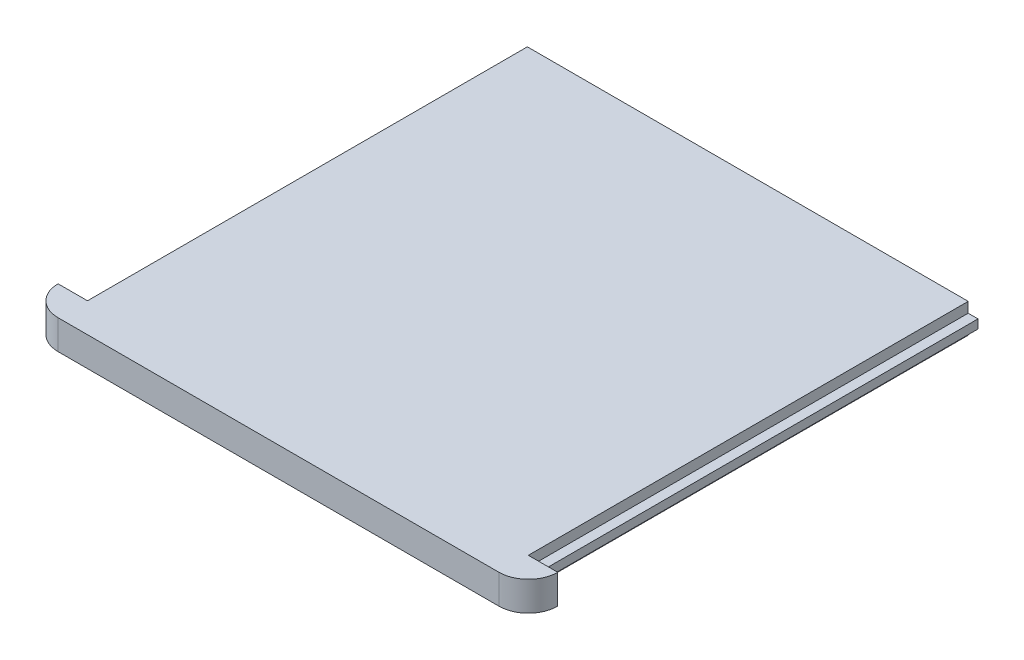
ISO-10303-21;
HEADER;
FILE_DESCRIPTION(('STEP AP214'),'2;1');
FILE_NAME('part.step','',(''),(''),'','','');
FILE_SCHEMA(('AUTOMOTIVE_DESIGN { 1 0 10303 214 1 1 1 1 }'));
ENDSEC;
DATA;
#1=APPLICATION_CONTEXT('core data for automotive mechanical design processes');
#2=APPLICATION_PROTOCOL_DEFINITION('international standard','automotive_design',2000,#1);
#3=PRODUCT_CONTEXT('',#1,'mechanical');
#4=PRODUCT('Part','Part','',(#3));
#5=PRODUCT_RELATED_PRODUCT_CATEGORY('part','',(#4));
#6=PRODUCT_DEFINITION_FORMATION('','',#4);
#7=PRODUCT_DEFINITION_CONTEXT('part definition',#1,'design');
#8=PRODUCT_DEFINITION('design','',#6,#7);
#9=PRODUCT_DEFINITION_SHAPE('','',#8);
#10=(LENGTH_UNIT() NAMED_UNIT(*) SI_UNIT(.MILLI.,.METRE.));
#11=(NAMED_UNIT(*) PLANE_ANGLE_UNIT() SI_UNIT($,.RADIAN.));
#12=(NAMED_UNIT(*) SI_UNIT($,.STERADIAN.) SOLID_ANGLE_UNIT());
#13=UNCERTAINTY_MEASURE_WITH_UNIT(LENGTH_MEASURE(1.E-05),#10,'distance_accuracy_value','');
#14=(GEOMETRIC_REPRESENTATION_CONTEXT(3) GLOBAL_UNCERTAINTY_ASSIGNED_CONTEXT((#13)) GLOBAL_UNIT_ASSIGNED_CONTEXT((#10,
#11,#12)) REPRESENTATION_CONTEXT('',''));
#15=CARTESIAN_POINT('',(0.,0.,0.));
#16=DIRECTION('',(0.,0.,1.));
#17=DIRECTION('',(1.,0.,0.));
#18=AXIS2_PLACEMENT_3D('',#15,#16,#17);
#19=CARTESIAN_POINT('',(-22.5,3.,-22.5));
#20=DIRECTION('',(1.,0.,0.));
#21=DIRECTION('',(0.,0.,-1.));
#22=AXIS2_PLACEMENT_3D('',#19,#20,#21);
#23=PLANE('',#22);
#24=DIRECTION('',(0.,-1.,0.));
#25=VECTOR('',#24,1.);
#26=CARTESIAN_POINT('',(-22.5,3.,22.4));
#27=LINE('',#26,#25);
#28=CARTESIAN_POINT('',(-22.5,3.,22.4));
#29=VERTEX_POINT('',#28);
#30=CARTESIAN_POINT('',(-22.5,1.95,22.4));
#31=VERTEX_POINT('',#30);
#32=EDGE_CURVE('E218',#29,#31,#27,.T.);
#33=ORIENTED_EDGE('',*,*,#32,.F.);
#34=DIRECTION('',(0.,0.,1.));
#35=VECTOR('',#34,1.);
#36=CARTESIAN_POINT('',(-22.5,3.,-22.5));
#37=LINE('',#36,#35);
#38=CARTESIAN_POINT('',(-22.5,3.,-22.5));
#39=VERTEX_POINT('',#38);
#40=EDGE_CURVE('E159',#39,#29,#37,.T.);
#41=ORIENTED_EDGE('',*,*,#40,.F.);
#42=DIRECTION('',(0.,-1.,0.));
#43=VECTOR('',#42,1.);
#44=CARTESIAN_POINT('',(-22.5,3.,-22.5));
#45=LINE('',#44,#43);
#46=CARTESIAN_POINT('',(-22.5,1.95,-22.5));
#47=VERTEX_POINT('',#46);
#48=EDGE_CURVE('E293',#39,#47,#45,.T.);
#49=ORIENTED_EDGE('',*,*,#48,.T.);
#50=DIRECTION('',(0.,0.,1.));
#51=VECTOR('',#50,1.);
#52=CARTESIAN_POINT('',(-22.5,1.95,-63.5));
#53=LINE('',#52,#51);
#54=EDGE_CURVE('E239',#47,#31,#53,.T.);
#55=ORIENTED_EDGE('',*,*,#54,.T.);
#56=EDGE_LOOP('',(#33,#41,#49,#55));
#57=FACE_BOUND('',#56,.T.);
#58=ADVANCED_FACE('F39',(#57),#23,.F.);
#59=DIRECTION('',(0.,-1.,0.));
#60=VECTOR('',#59,1.);
#61=CARTESIAN_POINT('',(-22.5,3.,22.4));
#62=LINE('',#61,#60);
#63=CARTESIAN_POINT('',(-22.5,1.05,22.4));
#64=VERTEX_POINT('',#63);
#65=CARTESIAN_POINT('',(-22.5,0.,22.4));
#66=VERTEX_POINT('',#65);
#67=EDGE_CURVE('E228',#64,#66,#62,.T.);
#68=ORIENTED_EDGE('',*,*,#67,.F.);
#69=DIRECTION('',(0.,0.,1.));
#70=VECTOR('',#69,1.);
#71=CARTESIAN_POINT('',(-22.5,1.05,-63.5));
#72=LINE('',#71,#70);
#73=CARTESIAN_POINT('',(-22.5,1.05,-22.5));
#74=VERTEX_POINT('',#73);
#75=EDGE_CURVE('E235',#74,#64,#72,.T.);
#76=ORIENTED_EDGE('',*,*,#75,.F.);
#77=CARTESIAN_POINT('',(-22.5,0.,-22.5));
#78=VERTEX_POINT('',#77);
#79=EDGE_CURVE('E284',#74,#78,#45,.T.);
#80=ORIENTED_EDGE('',*,*,#79,.T.);
#81=DIRECTION('',(0.,0.,1.));
#82=VECTOR('',#81,1.);
#83=CARTESIAN_POINT('',(-22.5,0.,-22.5));
#84=LINE('',#83,#82);
#85=EDGE_CURVE('E279',#78,#66,#84,.T.);
#86=ORIENTED_EDGE('',*,*,#85,.T.);
#87=EDGE_LOOP('',(#68,#76,#80,#86));
#88=FACE_BOUND('',#87,.T.);
#89=ADVANCED_FACE('F334',(#88),#23,.F.);
#90=CARTESIAN_POINT('',(22.5,3.,-22.5));
#91=DIRECTION('',(-1.,0.,0.));
#92=DIRECTION('',(0.,0.,1.));
#93=AXIS2_PLACEMENT_3D('',#90,#91,#92);
#94=PLANE('',#93);
#95=DIRECTION('',(0.,1.,0.));
#96=VECTOR('',#95,1.);
#97=CARTESIAN_POINT('',(22.5,3.,22.4));
#98=LINE('',#97,#96);
#99=CARTESIAN_POINT('',(22.5,1.95,22.4));
#100=VERTEX_POINT('',#99);
#101=CARTESIAN_POINT('',(22.5,3.,22.4));
#102=VERTEX_POINT('',#101);
#103=EDGE_CURVE('E199',#100,#102,#98,.T.);
#104=ORIENTED_EDGE('',*,*,#103,.F.);
#105=DIRECTION('',(0.,0.,1.));
#106=VECTOR('',#105,1.);
#107=CARTESIAN_POINT('',(22.5,1.95,-63.5));
#108=LINE('',#107,#106);
#109=CARTESIAN_POINT('',(22.5,1.95,-22.5));
#110=VERTEX_POINT('',#109);
#111=EDGE_CURVE('E234',#110,#100,#108,.T.);
#112=ORIENTED_EDGE('',*,*,#111,.F.);
#113=DIRECTION('',(0.,-1.,0.));
#114=VECTOR('',#113,1.);
#115=CARTESIAN_POINT('',(22.5,3.,-22.5));
#116=LINE('',#115,#114);
#117=CARTESIAN_POINT('',(22.5,3.,-22.5));
#118=VERTEX_POINT('',#117);
#119=EDGE_CURVE('E297',#118,#110,#116,.T.);
#120=ORIENTED_EDGE('',*,*,#119,.F.);
#121=DIRECTION('',(0.,0.,-1.));
#122=VECTOR('',#121,1.);
#123=CARTESIAN_POINT('',(22.5,3.,-22.5));
#124=LINE('',#123,#122);
#125=EDGE_CURVE('E275',#102,#118,#124,.T.);
#126=ORIENTED_EDGE('',*,*,#125,.F.);
#127=EDGE_LOOP('',(#104,#112,#120,#126));
#128=FACE_BOUND('',#127,.T.);
#129=ADVANCED_FACE('F340',(#128),#94,.F.);
#130=DIRECTION('',(0.,1.,0.));
#131=VECTOR('',#130,1.);
#132=CARTESIAN_POINT('',(22.5,3.,22.4));
#133=LINE('',#132,#131);
#134=CARTESIAN_POINT('',(22.5,0.,22.4));
#135=VERTEX_POINT('',#134);
#136=CARTESIAN_POINT('',(22.5,1.05,22.4));
#137=VERTEX_POINT('',#136);
#138=EDGE_CURVE('E215',#135,#137,#133,.T.);
#139=ORIENTED_EDGE('',*,*,#138,.F.);
#140=DIRECTION('',(0.,0.,-1.));
#141=VECTOR('',#140,1.);
#142=CARTESIAN_POINT('',(22.5,0.,-22.5));
#143=LINE('',#142,#141);
#144=CARTESIAN_POINT('',(22.5,0.,-22.5));
#145=VERTEX_POINT('',#144);
#146=EDGE_CURVE('E274',#135,#145,#143,.T.);
#147=ORIENTED_EDGE('',*,*,#146,.T.);
#148=CARTESIAN_POINT('',(22.5,1.05,-22.5));
#149=VERTEX_POINT('',#148);
#150=EDGE_CURVE('E296',#149,#145,#116,.T.);
#151=ORIENTED_EDGE('',*,*,#150,.F.);
#152=DIRECTION('',(0.,0.,1.));
#153=VECTOR('',#152,1.);
#154=CARTESIAN_POINT('',(22.5,1.05,-63.5));
#155=LINE('',#154,#153);
#156=EDGE_CURVE('E240',#149,#137,#155,.T.);
#157=ORIENTED_EDGE('',*,*,#156,.T.);
#158=EDGE_LOOP('',(#139,#147,#151,#157));
#159=FACE_BOUND('',#158,.T.);
#160=ADVANCED_FACE('F350',(#159),#94,.F.);
#161=CARTESIAN_POINT('',(0.,3.,0.));
#162=DIRECTION('',(0.,1.,0.));
#163=DIRECTION('',(0.,0.,1.));
#164=AXIS2_PLACEMENT_3D('',#161,#162,#163);
#165=PLANE('',#164);
#166=DIRECTION('',(-1.,0.,0.));
#167=VECTOR('',#166,1.);
#168=CARTESIAN_POINT('',(-25.5,3.,25.4));
#169=LINE('',#168,#167);
#170=CARTESIAN_POINT('',(22.5,3.,25.4));
#171=VERTEX_POINT('',#170);
#172=CARTESIAN_POINT('',(-22.5,3.,25.4));
#173=VERTEX_POINT('',#172);
#174=EDGE_CURVE('E194',#171,#173,#169,.T.);
#175=ORIENTED_EDGE('',*,*,#174,.F.);
#176=CARTESIAN_POINT('',(22.5,3.,22.4));
#177=DIRECTION('',(0.,1.,0.));
#178=DIRECTION('',(0.,0.,1.));
#179=AXIS2_PLACEMENT_3D('',#176,#177,#178);
#180=CIRCLE('',#179,3.);
#181=CARTESIAN_POINT('',(25.5,3.,22.4));
#182=VERTEX_POINT('',#181);
#183=EDGE_CURVE('E176',#171,#182,#180,.T.);
#184=ORIENTED_EDGE('',*,*,#183,.T.);
#185=DIRECTION('',(-1.,0.,0.));
#186=VECTOR('',#185,1.);
#187=CARTESIAN_POINT('',(-22.5,3.,22.4));
#188=LINE('',#187,#186);
#189=EDGE_CURVE('E163',#182,#102,#188,.T.);
#190=ORIENTED_EDGE('',*,*,#189,.T.);
#191=ORIENTED_EDGE('',*,*,#125,.T.);
#192=DIRECTION('',(-1.,0.,0.));
#193=VECTOR('',#192,1.);
#194=CARTESIAN_POINT('',(-22.5,3.,-22.5));
#195=LINE('',#194,#193);
#196=EDGE_CURVE('E278',#118,#39,#195,.T.);
#197=ORIENTED_EDGE('',*,*,#196,.T.);
#198=ORIENTED_EDGE('',*,*,#40,.T.);
#199=CARTESIAN_POINT('',(-25.5,3.,22.4));
#200=VERTEX_POINT('',#199);
#201=EDGE_CURVE('E151',#29,#200,#188,.T.);
#202=ORIENTED_EDGE('',*,*,#201,.T.);
#203=CARTESIAN_POINT('',(-22.5,3.,22.4));
#204=DIRECTION('',(0.,1.,0.));
#205=DIRECTION('',(0.,0.,1.));
#206=AXIS2_PLACEMENT_3D('',#203,#204,#205);
#207=CIRCLE('',#206,3.);
#208=EDGE_CURVE('E156',#200,#173,#207,.T.);
#209=ORIENTED_EDGE('',*,*,#208,.T.);
#210=EDGE_LOOP('',(#175,#184,#190,#191,#197,#198,#202,#209));
#211=FACE_BOUND('',#210,.T.);
#212=ADVANCED_FACE('F154',(#211),#165,.T.);
#213=CARTESIAN_POINT('',(0.,0.,0.));
#214=DIRECTION('',(0.,1.,0.));
#215=DIRECTION('',(0.,0.,1.));
#216=AXIS2_PLACEMENT_3D('',#213,#214,#215);
#217=PLANE('',#216);
#218=DIRECTION('',(1.,0.,0.));
#219=VECTOR('',#218,1.);
#220=CARTESIAN_POINT('',(25.5,0.,22.4));
#221=LINE('',#220,#219);
#222=CARTESIAN_POINT('',(25.5,0.,22.4));
#223=VERTEX_POINT('',#222);
#224=EDGE_CURVE('E172',#135,#223,#221,.T.);
#225=ORIENTED_EDGE('',*,*,#224,.T.);
#226=CARTESIAN_POINT('',(22.5,0.,22.4));
#227=DIRECTION('',(0.,1.,0.));
#228=DIRECTION('',(0.,0.,1.));
#229=AXIS2_PLACEMENT_3D('',#226,#227,#228);
#230=CIRCLE('',#229,3.);
#231=CARTESIAN_POINT('',(22.5,0.,25.4));
#232=VERTEX_POINT('',#231);
#233=EDGE_CURVE('E11',#223,#232,#230,.F.);
#234=ORIENTED_EDGE('',*,*,#233,.T.);
#235=DIRECTION('',(1.,0.,0.));
#236=VECTOR('',#235,1.);
#237=CARTESIAN_POINT('',(25.5,0.,25.4));
#238=LINE('',#237,#236);
#239=CARTESIAN_POINT('',(-22.5,0.,25.4));
#240=VERTEX_POINT('',#239);
#241=EDGE_CURVE('E189',#240,#232,#238,.T.);
#242=ORIENTED_EDGE('',*,*,#241,.F.);
#243=CARTESIAN_POINT('',(-22.5,0.,22.4));
#244=DIRECTION('',(0.,1.,0.));
#245=DIRECTION('',(0.,0.,1.));
#246=AXIS2_PLACEMENT_3D('',#243,#244,#245);
#247=CIRCLE('',#246,3.);
#248=CARTESIAN_POINT('',(-25.5,0.,22.4));
#249=VERTEX_POINT('',#248);
#250=EDGE_CURVE('E48',#240,#249,#247,.F.);
#251=ORIENTED_EDGE('',*,*,#250,.T.);
#252=EDGE_CURVE('E170',#249,#66,#221,.T.);
#253=ORIENTED_EDGE('',*,*,#252,.T.);
#254=ORIENTED_EDGE('',*,*,#85,.F.);
#255=DIRECTION('',(-1.,0.,0.));
#256=VECTOR('',#255,1.);
#257=CARTESIAN_POINT('',(-22.5,0.,-22.5));
#258=LINE('',#257,#256);
#259=EDGE_CURVE('E287',#145,#78,#258,.T.);
#260=ORIENTED_EDGE('',*,*,#259,.F.);
#261=ORIENTED_EDGE('',*,*,#146,.F.);
#262=EDGE_LOOP('',(#225,#234,#242,#251,#253,#254,#260,#261));
#263=FACE_BOUND('',#262,.T.);
#264=ADVANCED_FACE('F186',(#263),#217,.F.);
#265=CARTESIAN_POINT('',(23.5,0.,0.));
#266=DIRECTION('',(1.,0.,0.));
#267=DIRECTION('',(0.,0.,-1.));
#268=AXIS2_PLACEMENT_3D('',#265,#266,#267);
#269=PLANE('',#268);
#270=DIRECTION('',(0.,0.,-1.));
#271=VECTOR('',#270,1.);
#272=CARTESIAN_POINT('',(23.5,1.95,0.));
#273=LINE('',#272,#271);
#274=CARTESIAN_POINT('',(23.5,1.95,22.4));
#275=VERTEX_POINT('',#274);
#276=CARTESIAN_POINT('',(23.5,1.95,-22.5));
#277=VERTEX_POINT('',#276);
#278=EDGE_CURVE('E311',#275,#277,#273,.T.);
#279=ORIENTED_EDGE('',*,*,#278,.F.);
#280=DIRECTION('',(0.,-1.,0.));
#281=VECTOR('',#280,1.);
#282=CARTESIAN_POINT('',(23.5,0.,22.4));
#283=LINE('',#282,#281);
#284=CARTESIAN_POINT('',(23.5,1.05,22.4));
#285=VERTEX_POINT('',#284);
#286=EDGE_CURVE('E193',#275,#285,#283,.T.);
#287=ORIENTED_EDGE('',*,*,#286,.T.);
#288=DIRECTION('',(0.,0.,1.));
#289=VECTOR('',#288,1.);
#290=CARTESIAN_POINT('',(23.5,1.05,0.));
#291=LINE('',#290,#289);
#292=CARTESIAN_POINT('',(23.5,1.05,-22.5));
#293=VERTEX_POINT('',#292);
#294=EDGE_CURVE('E307',#293,#285,#291,.T.);
#295=ORIENTED_EDGE('',*,*,#294,.F.);
#296=DIRECTION('',(0.,1.,0.));
#297=VECTOR('',#296,1.);
#298=CARTESIAN_POINT('',(23.5,1.,-22.5));
#299=LINE('',#298,#297);
#300=EDGE_CURVE('E270',#293,#277,#299,.T.);
#301=ORIENTED_EDGE('',*,*,#300,.T.);
#302=EDGE_LOOP('',(#279,#287,#295,#301));
#303=FACE_BOUND('',#302,.T.);
#304=ADVANCED_FACE('F366',(#303),#269,.T.);
#305=CARTESIAN_POINT('',(-23.5,0.,0.));
#306=DIRECTION('',(-1.,0.,0.));
#307=DIRECTION('',(0.,-1.,0.));
#308=AXIS2_PLACEMENT_3D('',#305,#306,#307);
#309=PLANE('',#308);
#310=DIRECTION('',(0.,0.,-1.));
#311=VECTOR('',#310,1.);
#312=CARTESIAN_POINT('',(-23.5,1.05,0.));
#313=LINE('',#312,#311);
#314=CARTESIAN_POINT('',(-23.5,1.05,22.4));
#315=VERTEX_POINT('',#314);
#316=CARTESIAN_POINT('',(-23.5,1.05,-22.5));
#317=VERTEX_POINT('',#316);
#318=EDGE_CURVE('E304',#315,#317,#313,.T.);
#319=ORIENTED_EDGE('',*,*,#318,.F.);
#320=DIRECTION('',(0.,1.,0.));
#321=VECTOR('',#320,1.);
#322=CARTESIAN_POINT('',(-23.5,0.,22.4));
#323=LINE('',#322,#321);
#324=CARTESIAN_POINT('',(-23.5,1.95,22.4));
#325=VERTEX_POINT('',#324);
#326=EDGE_CURVE('E224',#315,#325,#323,.T.);
#327=ORIENTED_EDGE('',*,*,#326,.T.);
#328=DIRECTION('',(0.,0.,1.));
#329=VECTOR('',#328,1.);
#330=CARTESIAN_POINT('',(-23.5,1.95,0.));
#331=LINE('',#330,#329);
#332=CARTESIAN_POINT('',(-23.5,1.95,-22.5));
#333=VERTEX_POINT('',#332);
#334=EDGE_CURVE('E300',#333,#325,#331,.T.);
#335=ORIENTED_EDGE('',*,*,#334,.F.);
#336=DIRECTION('',(0.,-1.,0.));
#337=VECTOR('',#336,1.);
#338=CARTESIAN_POINT('',(-23.5,2.,-22.5));
#339=LINE('',#338,#337);
#340=EDGE_CURVE('E266',#333,#317,#339,.T.);
#341=ORIENTED_EDGE('',*,*,#340,.T.);
#342=EDGE_LOOP('',(#319,#327,#335,#341));
#343=FACE_BOUND('',#342,.T.);
#344=ADVANCED_FACE('F385',(#343),#309,.T.);
#345=CARTESIAN_POINT('',(-23.5,1.95,-63.5));
#346=DIRECTION('',(0.,-1.,0.));
#347=DIRECTION('',(0.,0.,-1.));
#348=AXIS2_PLACEMENT_3D('',#345,#346,#347);
#349=PLANE('',#348);
#350=DIRECTION('',(-1.,0.,0.));
#351=VECTOR('',#350,1.);
#352=CARTESIAN_POINT('',(-23.5,1.95,22.4));
#353=LINE('',#352,#351);
#354=EDGE_CURVE('E221',#31,#325,#353,.T.);
#355=ORIENTED_EDGE('',*,*,#354,.F.);
#356=ORIENTED_EDGE('',*,*,#54,.F.);
#357=DIRECTION('',(1.,0.,0.));
#358=VECTOR('',#357,1.);
#359=CARTESIAN_POINT('',(-22.5,1.95,-22.5));
#360=LINE('',#359,#358);
#361=EDGE_CURVE('E250',#333,#47,#360,.T.);
#362=ORIENTED_EDGE('',*,*,#361,.F.);
#363=ORIENTED_EDGE('',*,*,#334,.T.);
#364=EDGE_LOOP('',(#355,#356,#362,#363));
#365=FACE_BOUND('',#364,.T.);
#366=ADVANCED_FACE('F391',(#365),#349,.F.);
#367=CARTESIAN_POINT('',(-23.5,1.05,-63.5));
#368=DIRECTION('',(0.,1.,0.));
#369=DIRECTION('',(0.,0.,1.));
#370=AXIS2_PLACEMENT_3D('',#367,#368,#369);
#371=PLANE('',#370);
#372=DIRECTION('',(1.,0.,0.));
#373=VECTOR('',#372,1.);
#374=CARTESIAN_POINT('',(-23.5,1.05,22.4));
#375=LINE('',#374,#373);
#376=EDGE_CURVE('E231',#315,#64,#375,.T.);
#377=ORIENTED_EDGE('',*,*,#376,.F.);
#378=ORIENTED_EDGE('',*,*,#318,.T.);
#379=DIRECTION('',(-1.,0.,0.));
#380=VECTOR('',#379,1.);
#381=CARTESIAN_POINT('',(-22.5,1.05,-22.5));
#382=LINE('',#381,#380);
#383=EDGE_CURVE('E254',#74,#317,#382,.T.);
#384=ORIENTED_EDGE('',*,*,#383,.F.);
#385=ORIENTED_EDGE('',*,*,#75,.T.);
#386=EDGE_LOOP('',(#377,#378,#384,#385));
#387=FACE_BOUND('',#386,.T.);
#388=ADVANCED_FACE('F382',(#387),#371,.F.);
#389=CARTESIAN_POINT('',(23.5,1.05,-63.5));
#390=DIRECTION('',(0.,1.,0.));
#391=DIRECTION('',(0.,0.,1.));
#392=AXIS2_PLACEMENT_3D('',#389,#390,#391);
#393=PLANE('',#392);
#394=DIRECTION('',(1.,0.,0.));
#395=VECTOR('',#394,1.);
#396=CARTESIAN_POINT('',(23.5,1.05,22.4));
#397=LINE('',#396,#395);
#398=EDGE_CURVE('E212',#137,#285,#397,.T.);
#399=ORIENTED_EDGE('',*,*,#398,.F.);
#400=ORIENTED_EDGE('',*,*,#156,.F.);
#401=DIRECTION('',(-1.,0.,0.));
#402=VECTOR('',#401,1.);
#403=CARTESIAN_POINT('',(-22.5,1.05,-22.5));
#404=LINE('',#403,#402);
#405=EDGE_CURVE('E258',#293,#149,#404,.T.);
#406=ORIENTED_EDGE('',*,*,#405,.F.);
#407=ORIENTED_EDGE('',*,*,#294,.T.);
#408=EDGE_LOOP('',(#399,#400,#406,#407));
#409=FACE_BOUND('',#408,.T.);
#410=ADVANCED_FACE('F369',(#409),#393,.F.);
#411=CARTESIAN_POINT('',(23.5,1.95,-63.5));
#412=DIRECTION('',(0.,-1.,0.));
#413=DIRECTION('',(0.,0.,-1.));
#414=AXIS2_PLACEMENT_3D('',#411,#412,#413);
#415=PLANE('',#414);
#416=DIRECTION('',(-1.,0.,0.));
#417=VECTOR('',#416,1.);
#418=CARTESIAN_POINT('',(23.5,1.95,22.4));
#419=LINE('',#418,#417);
#420=EDGE_CURVE('E314',#275,#100,#419,.T.);
#421=ORIENTED_EDGE('',*,*,#420,.F.);
#422=ORIENTED_EDGE('',*,*,#278,.T.);
#423=DIRECTION('',(1.,0.,0.));
#424=VECTOR('',#423,1.);
#425=CARTESIAN_POINT('',(-22.5,1.95,-22.5));
#426=LINE('',#425,#424);
#427=EDGE_CURVE('E262',#110,#277,#426,.T.);
#428=ORIENTED_EDGE('',*,*,#427,.F.);
#429=ORIENTED_EDGE('',*,*,#111,.T.);
#430=EDGE_LOOP('',(#421,#422,#428,#429));
#431=FACE_BOUND('',#430,.T.);
#432=ADVANCED_FACE('F347',(#431),#415,.F.);
#433=CARTESIAN_POINT('',(-22.5,3.,-22.5));
#434=DIRECTION('',(0.,0.,1.));
#435=DIRECTION('',(1.,0.,0.));
#436=AXIS2_PLACEMENT_3D('',#433,#434,#435);
#437=PLANE('',#436);
#438=ORIENTED_EDGE('',*,*,#119,.T.);
#439=ORIENTED_EDGE('',*,*,#427,.T.);
#440=ORIENTED_EDGE('',*,*,#300,.F.);
#441=ORIENTED_EDGE('',*,*,#405,.T.);
#442=ORIENTED_EDGE('',*,*,#150,.T.);
#443=ORIENTED_EDGE('',*,*,#259,.T.);
#444=ORIENTED_EDGE('',*,*,#79,.F.);
#445=ORIENTED_EDGE('',*,*,#383,.T.);
#446=ORIENTED_EDGE('',*,*,#340,.F.);
#447=ORIENTED_EDGE('',*,*,#361,.T.);
#448=ORIENTED_EDGE('',*,*,#48,.F.);
#449=ORIENTED_EDGE('',*,*,#196,.F.);
#450=EDGE_LOOP('',(#438,#439,#440,#441,#442,#443,#444,#445,#446,#447,#448,#449));
#451=FACE_BOUND('',#450,.T.);
#452=ADVANCED_FACE('F345',(#451),#437,.F.);
#453=CARTESIAN_POINT('',(0.,0.,22.4));
#454=DIRECTION('',(0.,0.,-1.));
#455=DIRECTION('',(-1.,0.,0.));
#456=AXIS2_PLACEMENT_3D('',#453,#454,#455);
#457=PLANE('',#456);
#458=ORIENTED_EDGE('',*,*,#224,.F.);
#459=ORIENTED_EDGE('',*,*,#138,.T.);
#460=ORIENTED_EDGE('',*,*,#398,.T.);
#461=ORIENTED_EDGE('',*,*,#286,.F.);
#462=ORIENTED_EDGE('',*,*,#420,.T.);
#463=ORIENTED_EDGE('',*,*,#103,.T.);
#464=ORIENTED_EDGE('',*,*,#189,.F.);
#465=DIRECTION('',(0.,1.,0.));
#466=VECTOR('',#465,1.);
#467=CARTESIAN_POINT('',(25.5,3.,22.4));
#468=LINE('',#467,#466);
#469=EDGE_CURVE('E164',#223,#182,#468,.T.);
#470=ORIENTED_EDGE('',*,*,#469,.F.);
#471=EDGE_LOOP('',(#458,#459,#460,#461,#462,#463,#464,#470));
#472=FACE_BOUND('',#471,.T.);
#473=ADVANCED_FACE('F323',(#472),#457,.T.);
#474=CARTESIAN_POINT('',(0.,0.,25.4));
#475=DIRECTION('',(0.,0.,-1.));
#476=DIRECTION('',(-1.,0.,0.));
#477=AXIS2_PLACEMENT_3D('',#474,#475,#476);
#478=PLANE('',#477);
#479=ORIENTED_EDGE('',*,*,#241,.T.);
#480=DIRECTION('',(0.,1.,0.));
#481=VECTOR('',#480,1.);
#482=CARTESIAN_POINT('',(22.5,0.,25.4));
#483=LINE('',#482,#481);
#484=EDGE_CURVE('E177',#232,#171,#483,.T.);
#485=ORIENTED_EDGE('',*,*,#484,.T.);
#486=ORIENTED_EDGE('',*,*,#174,.T.);
#487=DIRECTION('',(0.,-1.,0.));
#488=VECTOR('',#487,1.);
#489=CARTESIAN_POINT('',(-22.5,0.,25.4));
#490=LINE('',#489,#488);
#491=EDGE_CURVE('E174',#173,#240,#490,.T.);
#492=ORIENTED_EDGE('',*,*,#491,.T.);
#493=EDGE_LOOP('',(#479,#485,#486,#492));
#494=FACE_BOUND('',#493,.T.);
#495=ADVANCED_FACE('F317',(#494),#478,.F.);
#496=ORIENTED_EDGE('',*,*,#376,.T.);
#497=ORIENTED_EDGE('',*,*,#67,.T.);
#498=ORIENTED_EDGE('',*,*,#252,.F.);
#499=DIRECTION('',(0.,-1.,0.));
#500=VECTOR('',#499,1.);
#501=CARTESIAN_POINT('',(-25.5,0.,22.4));
#502=LINE('',#501,#500);
#503=EDGE_CURVE('E167',#200,#249,#502,.T.);
#504=ORIENTED_EDGE('',*,*,#503,.F.);
#505=ORIENTED_EDGE('',*,*,#201,.F.);
#506=ORIENTED_EDGE('',*,*,#32,.T.);
#507=ORIENTED_EDGE('',*,*,#354,.T.);
#508=ORIENTED_EDGE('',*,*,#326,.F.);
#509=EDGE_LOOP('',(#496,#497,#498,#504,#505,#506,#507,#508));
#510=FACE_BOUND('',#509,.T.);
#511=ADVANCED_FACE('F168',(#510),#457,.T.);
#512=CARTESIAN_POINT('',(22.5,0.,22.4));
#513=DIRECTION('',(0.,1.,0.));
#514=DIRECTION('',(0.,0.,1.));
#515=AXIS2_PLACEMENT_3D('',#512,#513,#514);
#516=CYLINDRICAL_SURFACE('',#515,3.);
#517=ORIENTED_EDGE('',*,*,#233,.F.);
#518=ORIENTED_EDGE('',*,*,#469,.T.);
#519=ORIENTED_EDGE('',*,*,#183,.F.);
#520=ORIENTED_EDGE('',*,*,#484,.F.);
#521=EDGE_LOOP('',(#517,#518,#519,#520));
#522=FACE_BOUND('',#521,.T.);
#523=ADVANCED_FACE('F325',(#522),#516,.T.);
#524=CARTESIAN_POINT('',(-22.5,0.,22.4));
#525=DIRECTION('',(0.,-1.,0.));
#526=DIRECTION('',(0.,0.,-1.));
#527=AXIS2_PLACEMENT_3D('',#524,#525,#526);
#528=CYLINDRICAL_SURFACE('',#527,3.);
#529=ORIENTED_EDGE('',*,*,#208,.F.);
#530=ORIENTED_EDGE('',*,*,#503,.T.);
#531=ORIENTED_EDGE('',*,*,#250,.F.);
#532=ORIENTED_EDGE('',*,*,#491,.F.);
#533=EDGE_LOOP('',(#529,#530,#531,#532));
#534=FACE_BOUND('',#533,.T.);
#535=ADVANCED_FACE('F41',(#534),#528,.T.);
#536=CLOSED_SHELL('',(#58,#89,#129,#160,#212,#264,#304,#344,#366,#388,#410,#432,#452,#473,#495,
#511,#523,#535));
#537=MANIFOLD_SOLID_BREP('B2',#536);
#538=ADVANCED_BREP_SHAPE_REPRESENTATION('',(#18,#537),#14);
#539=SHAPE_DEFINITION_REPRESENTATION(#9,#538);
ENDSEC;
END-ISO-10303-21;
